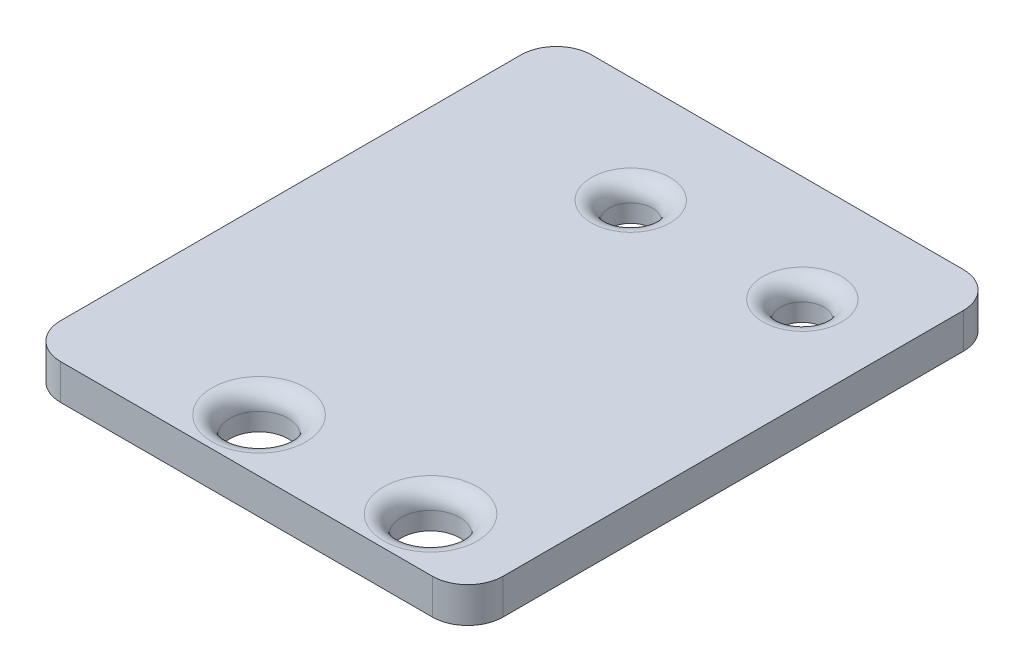
ISO-10303-21;
HEADER;
FILE_DESCRIPTION(('STEP AP214'),'2;1');
FILE_NAME('part.step','',(''),(''),'','','');
FILE_SCHEMA(('AUTOMOTIVE_DESIGN { 1 0 10303 214 1 1 1 1 }'));
ENDSEC;
DATA;
#1=APPLICATION_CONTEXT('core data for automotive mechanical design processes');
#2=APPLICATION_PROTOCOL_DEFINITION('international standard','automotive_design',2000,#1);
#3=PRODUCT_CONTEXT('',#1,'mechanical');
#4=PRODUCT('Part','Part','',(#3));
#5=PRODUCT_RELATED_PRODUCT_CATEGORY('part','',(#4));
#6=PRODUCT_DEFINITION_FORMATION('','',#4);
#7=PRODUCT_DEFINITION_CONTEXT('part definition',#1,'design');
#8=PRODUCT_DEFINITION('design','',#6,#7);
#9=PRODUCT_DEFINITION_SHAPE('','',#8);
#10=(LENGTH_UNIT() NAMED_UNIT(*) SI_UNIT(.MILLI.,.METRE.));
#11=(NAMED_UNIT(*) PLANE_ANGLE_UNIT() SI_UNIT($,.RADIAN.));
#12=(NAMED_UNIT(*) SI_UNIT($,.STERADIAN.) SOLID_ANGLE_UNIT());
#13=UNCERTAINTY_MEASURE_WITH_UNIT(LENGTH_MEASURE(1.E-05),#10,'distance_accuracy_value','');
#14=(GEOMETRIC_REPRESENTATION_CONTEXT(3) GLOBAL_UNCERTAINTY_ASSIGNED_CONTEXT((#13)) GLOBAL_UNIT_ASSIGNED_CONTEXT((#10,
#11,#12)) REPRESENTATION_CONTEXT('',''));
#15=CARTESIAN_POINT('',(0.,0.,0.));
#16=DIRECTION('',(0.,0.,1.));
#17=DIRECTION('',(1.,0.,0.));
#18=AXIS2_PLACEMENT_3D('',#15,#16,#17);
#19=CARTESIAN_POINT('',(0.,2.,0.));
#20=DIRECTION('',(0.,1.,0.));
#21=DIRECTION('',(0.,0.,1.));
#22=AXIS2_PLACEMENT_3D('',#19,#20,#21);
#23=PLANE('',#22);
#24=CARTESIAN_POINT('',(19.9,2.,-3.));
#25=DIRECTION('',(0.,1.,0.));
#26=DIRECTION('',(0.,0.,1.));
#27=AXIS2_PLACEMENT_3D('',#24,#25,#26);
#28=CIRCLE('',#27,2.65);
#29=CARTESIAN_POINT('',(19.9,2.,-0.35));
#30=VERTEX_POINT('',#29);
#31=EDGE_CURVE('E210',#30,#30,#28,.F.);
#32=ORIENTED_EDGE('',*,*,#31,.T.);
#33=EDGE_LOOP('',(#32));
#34=FACE_BOUND('',#33,.T.);
#35=CARTESIAN_POINT('',(10.21,2.,-3.));
#36=DIRECTION('',(0.,1.,0.));
#37=DIRECTION('',(0.,0.,1.));
#38=AXIS2_PLACEMENT_3D('',#35,#36,#37);
#39=CIRCLE('',#38,2.65);
#40=CARTESIAN_POINT('',(10.21,2.,-0.349999999999999));
#41=VERTEX_POINT('',#40);
#42=EDGE_CURVE('E206',#41,#41,#39,.F.);
#43=ORIENTED_EDGE('',*,*,#42,.T.);
#44=EDGE_LOOP('',(#43));
#45=FACE_BOUND('',#44,.T.);
#46=CARTESIAN_POINT('',(19.9,2.,-24.));
#47=DIRECTION('',(0.,1.,0.));
#48=DIRECTION('',(0.,0.,1.));
#49=AXIS2_PLACEMENT_3D('',#46,#47,#48);
#50=CIRCLE('',#49,2.225);
#51=CARTESIAN_POINT('',(19.9,2.,-21.775));
#52=VERTEX_POINT('',#51);
#53=EDGE_CURVE('E202',#52,#52,#50,.F.);
#54=ORIENTED_EDGE('',*,*,#53,.T.);
#55=EDGE_LOOP('',(#54));
#56=FACE_BOUND('',#55,.T.);
#57=CARTESIAN_POINT('',(10.21,2.,-24.));
#58=DIRECTION('',(0.,1.,0.));
#59=DIRECTION('',(0.,0.,1.));
#60=AXIS2_PLACEMENT_3D('',#57,#58,#59);
#61=CIRCLE('',#60,2.225);
#62=CARTESIAN_POINT('',(10.21,2.,-21.775));
#63=VERTEX_POINT('',#62);
#64=EDGE_CURVE('E198',#63,#63,#61,.F.);
#65=ORIENTED_EDGE('',*,*,#64,.T.);
#66=EDGE_LOOP('',(#65));
#67=FACE_BOUND('',#66,.T.);
#68=DIRECTION('',(-1.,0.,0.));
#69=VECTOR('',#68,1.);
#70=CARTESIAN_POINT('',(25.,2.,-30.));
#71=LINE('',#70,#69);
#72=CARTESIAN_POINT('',(23.,2.,-30.));
#73=VERTEX_POINT('',#72);
#74=CARTESIAN_POINT('',(2.,2.,-30.));
#75=VERTEX_POINT('',#74);
#76=EDGE_CURVE('E148',#73,#75,#71,.T.);
#77=ORIENTED_EDGE('',*,*,#76,.T.);
#78=CARTESIAN_POINT('',(2.,2.,-28.));
#79=DIRECTION('',(0.,1.,0.));
#80=DIRECTION('',(0.,0.,1.));
#81=AXIS2_PLACEMENT_3D('',#78,#79,#80);
#82=CIRCLE('',#81,2.);
#83=CARTESIAN_POINT('',(0.,2.,-28.));
#84=VERTEX_POINT('',#83);
#85=EDGE_CURVE('E178',#75,#84,#82,.T.);
#86=ORIENTED_EDGE('',*,*,#85,.T.);
#87=DIRECTION('',(0.,0.,1.));
#88=VECTOR('',#87,1.);
#89=CARTESIAN_POINT('',(0.,2.,-30.));
#90=LINE('',#89,#88);
#91=CARTESIAN_POINT('',(0.,2.,-2.));
#92=VERTEX_POINT('',#91);
#93=EDGE_CURVE('E127',#84,#92,#90,.T.);
#94=ORIENTED_EDGE('',*,*,#93,.T.);
#95=CARTESIAN_POINT('',(2.,2.,-2.));
#96=DIRECTION('',(0.,1.,0.));
#97=DIRECTION('',(0.,0.,1.));
#98=AXIS2_PLACEMENT_3D('',#95,#96,#97);
#99=CIRCLE('',#98,2.);
#100=CARTESIAN_POINT('',(2.,2.,0.));
#101=VERTEX_POINT('',#100);
#102=EDGE_CURVE('E175',#92,#101,#99,.T.);
#103=ORIENTED_EDGE('',*,*,#102,.T.);
#104=DIRECTION('',(1.,0.,0.));
#105=VECTOR('',#104,1.);
#106=CARTESIAN_POINT('',(0.,2.,0.));
#107=LINE('',#106,#105);
#108=CARTESIAN_POINT('',(23.,2.,0.));
#109=VERTEX_POINT('',#108);
#110=EDGE_CURVE('E304',#101,#109,#107,.T.);
#111=ORIENTED_EDGE('',*,*,#110,.T.);
#112=CARTESIAN_POINT('',(23.,2.,-2.));
#113=DIRECTION('',(0.,1.,0.));
#114=DIRECTION('',(0.,0.,1.));
#115=AXIS2_PLACEMENT_3D('',#112,#113,#114);
#116=CIRCLE('',#115,2.);
#117=CARTESIAN_POINT('',(25.,2.,-2.));
#118=VERTEX_POINT('',#117);
#119=EDGE_CURVE('E61',#109,#118,#116,.T.);
#120=ORIENTED_EDGE('',*,*,#119,.T.);
#121=DIRECTION('',(0.,0.,-1.));
#122=VECTOR('',#121,1.);
#123=CARTESIAN_POINT('',(25.,2.,0.));
#124=LINE('',#123,#122);
#125=CARTESIAN_POINT('',(25.,2.,-28.));
#126=VERTEX_POINT('',#125);
#127=EDGE_CURVE('E306',#118,#126,#124,.T.);
#128=ORIENTED_EDGE('',*,*,#127,.T.);
#129=CARTESIAN_POINT('',(23.,2.,-28.));
#130=DIRECTION('',(0.,1.,0.));
#131=DIRECTION('',(0.,0.,1.));
#132=AXIS2_PLACEMENT_3D('',#129,#130,#131);
#133=CIRCLE('',#132,2.);
#134=EDGE_CURVE('E170',#126,#73,#133,.T.);
#135=ORIENTED_EDGE('',*,*,#134,.T.);
#136=EDGE_LOOP('',(#77,#86,#94,#103,#111,#120,#128,#135));
#137=FACE_BOUND('',#136,.T.);
#138=ADVANCED_FACE('F38',(#34,#45,#56,#67,#137),#23,.T.);
#139=CARTESIAN_POINT('',(0.,0.,0.));
#140=DIRECTION('',(0.,1.,0.));
#141=DIRECTION('',(0.,0.,1.));
#142=AXIS2_PLACEMENT_3D('',#139,#140,#141);
#143=PLANE('',#142);
#144=DIRECTION('',(0.,0.,1.));
#145=VECTOR('',#144,1.);
#146=CARTESIAN_POINT('',(0.,0.,-30.));
#147=LINE('',#146,#145);
#148=CARTESIAN_POINT('',(0.,0.,-28.));
#149=VERTEX_POINT('',#148);
#150=CARTESIAN_POINT('',(0.,0.,-2.));
#151=VERTEX_POINT('',#150);
#152=EDGE_CURVE('E124',#149,#151,#147,.T.);
#153=ORIENTED_EDGE('',*,*,#152,.F.);
#154=CARTESIAN_POINT('',(2.,0.,-28.));
#155=DIRECTION('',(0.,1.,0.));
#156=DIRECTION('',(0.,0.,1.));
#157=AXIS2_PLACEMENT_3D('',#154,#155,#156);
#158=CIRCLE('',#157,2.);
#159=CARTESIAN_POINT('',(2.,0.,-30.));
#160=VERTEX_POINT('',#159);
#161=EDGE_CURVE('E106',#149,#160,#158,.F.);
#162=ORIENTED_EDGE('',*,*,#161,.T.);
#163=DIRECTION('',(-1.,0.,0.));
#164=VECTOR('',#163,1.);
#165=CARTESIAN_POINT('',(25.,0.,-30.));
#166=LINE('',#165,#164);
#167=CARTESIAN_POINT('',(23.,0.,-30.));
#168=VERTEX_POINT('',#167);
#169=EDGE_CURVE('E153',#168,#160,#166,.T.);
#170=ORIENTED_EDGE('',*,*,#169,.F.);
#171=CARTESIAN_POINT('',(23.,0.,-28.));
#172=DIRECTION('',(0.,1.,0.));
#173=DIRECTION('',(0.,0.,1.));
#174=AXIS2_PLACEMENT_3D('',#171,#172,#173);
#175=CIRCLE('',#174,2.);
#176=CARTESIAN_POINT('',(25.,0.,-28.));
#177=VERTEX_POINT('',#176);
#178=EDGE_CURVE('E129',#168,#177,#175,.F.);
#179=ORIENTED_EDGE('',*,*,#178,.T.);
#180=DIRECTION('',(0.,0.,-1.));
#181=VECTOR('',#180,1.);
#182=CARTESIAN_POINT('',(25.,0.,0.));
#183=LINE('',#182,#181);
#184=CARTESIAN_POINT('',(25.,0.,-2.));
#185=VERTEX_POINT('',#184);
#186=EDGE_CURVE('E142',#185,#177,#183,.T.);
#187=ORIENTED_EDGE('',*,*,#186,.F.);
#188=CARTESIAN_POINT('',(23.,0.,-2.));
#189=DIRECTION('',(0.,1.,0.));
#190=DIRECTION('',(0.,0.,1.));
#191=AXIS2_PLACEMENT_3D('',#188,#189,#190);
#192=CIRCLE('',#191,2.);
#193=CARTESIAN_POINT('',(23.,0.,0.));
#194=VERTEX_POINT('',#193);
#195=EDGE_CURVE('E160',#185,#194,#192,.F.);
#196=ORIENTED_EDGE('',*,*,#195,.T.);
#197=DIRECTION('',(1.,0.,0.));
#198=VECTOR('',#197,1.);
#199=CARTESIAN_POINT('',(0.,0.,0.));
#200=LINE('',#199,#198);
#201=CARTESIAN_POINT('',(2.,0.,0.));
#202=VERTEX_POINT('',#201);
#203=EDGE_CURVE('E136',#202,#194,#200,.T.);
#204=ORIENTED_EDGE('',*,*,#203,.F.);
#205=CARTESIAN_POINT('',(2.,0.,-2.));
#206=DIRECTION('',(0.,1.,0.));
#207=DIRECTION('',(0.,0.,1.));
#208=AXIS2_PLACEMENT_3D('',#205,#206,#207);
#209=CIRCLE('',#208,2.);
#210=EDGE_CURVE('E118',#202,#151,#209,.F.);
#211=ORIENTED_EDGE('',*,*,#210,.T.);
#212=EDGE_LOOP('',(#153,#162,#170,#179,#187,#196,#204,#211));
#213=FACE_BOUND('',#212,.T.);
#214=CARTESIAN_POINT('',(19.9,0.,-24.));
#215=DIRECTION('',(0.,1.,0.));
#216=DIRECTION('',(0.,0.,1.));
#217=AXIS2_PLACEMENT_3D('',#214,#215,#216);
#218=CIRCLE('',#217,1.225);
#219=CARTESIAN_POINT('',(19.9,0.,-22.775));
#220=VERTEX_POINT('',#219);
#221=EDGE_CURVE('E137',#220,#220,#218,.T.);
#222=ORIENTED_EDGE('',*,*,#221,.T.);
#223=EDGE_LOOP('',(#222));
#224=FACE_BOUND('',#223,.T.);
#225=CARTESIAN_POINT('',(10.21,0.,-24.));
#226=DIRECTION('',(0.,1.,0.));
#227=DIRECTION('',(0.,0.,1.));
#228=AXIS2_PLACEMENT_3D('',#225,#226,#227);
#229=CIRCLE('',#228,1.225);
#230=CARTESIAN_POINT('',(10.21,0.,-22.775));
#231=VERTEX_POINT('',#230);
#232=EDGE_CURVE('E145',#231,#231,#229,.T.);
#233=ORIENTED_EDGE('',*,*,#232,.T.);
#234=EDGE_LOOP('',(#233));
#235=FACE_BOUND('',#234,.T.);
#236=CARTESIAN_POINT('',(10.21,0.,-3.));
#237=DIRECTION('',(0.,1.,0.));
#238=DIRECTION('',(0.,0.,1.));
#239=AXIS2_PLACEMENT_3D('',#236,#237,#238);
#240=CIRCLE('',#239,1.65);
#241=CARTESIAN_POINT('',(10.21,0.,-1.35));
#242=VERTEX_POINT('',#241);
#243=EDGE_CURVE('E293',#242,#242,#240,.T.);
#244=ORIENTED_EDGE('',*,*,#243,.T.);
#245=EDGE_LOOP('',(#244));
#246=FACE_BOUND('',#245,.T.);
#247=CARTESIAN_POINT('',(19.9,0.,-3.));
#248=DIRECTION('',(0.,1.,0.));
#249=DIRECTION('',(0.,0.,1.));
#250=AXIS2_PLACEMENT_3D('',#247,#248,#249);
#251=CIRCLE('',#250,1.65);
#252=CARTESIAN_POINT('',(19.9,0.,-1.35));
#253=VERTEX_POINT('',#252);
#254=EDGE_CURVE('E290',#253,#253,#251,.T.);
#255=ORIENTED_EDGE('',*,*,#254,.T.);
#256=EDGE_LOOP('',(#255));
#257=FACE_BOUND('',#256,.T.);
#258=ADVANCED_FACE('F132',(#213,#224,#235,#246,#257),#143,.F.);
#259=CARTESIAN_POINT('',(0.,2.,-30.));
#260=DIRECTION('',(1.,0.,0.));
#261=DIRECTION('',(0.,0.,-1.));
#262=AXIS2_PLACEMENT_3D('',#259,#260,#261);
#263=PLANE('',#262);
#264=ORIENTED_EDGE('',*,*,#93,.F.);
#265=DIRECTION('',(0.,-1.,0.));
#266=VECTOR('',#265,1.);
#267=CARTESIAN_POINT('',(0.,2.,-28.));
#268=LINE('',#267,#266);
#269=EDGE_CURVE('E110',#84,#149,#268,.T.);
#270=ORIENTED_EDGE('',*,*,#269,.T.);
#271=ORIENTED_EDGE('',*,*,#152,.T.);
#272=DIRECTION('',(0.,-1.,0.));
#273=VECTOR('',#272,1.);
#274=CARTESIAN_POINT('',(0.,2.,-2.));
#275=LINE('',#274,#273);
#276=EDGE_CURVE('E130',#151,#92,#275,.F.);
#277=ORIENTED_EDGE('',*,*,#276,.T.);
#278=EDGE_LOOP('',(#264,#270,#271,#277));
#279=FACE_BOUND('',#278,.T.);
#280=ADVANCED_FACE('F123',(#279),#263,.F.);
#281=CARTESIAN_POINT('',(0.,2.,0.));
#282=DIRECTION('',(0.,0.,-1.));
#283=DIRECTION('',(-1.,0.,0.));
#284=AXIS2_PLACEMENT_3D('',#281,#282,#283);
#285=PLANE('',#284);
#286=ORIENTED_EDGE('',*,*,#110,.F.);
#287=DIRECTION('',(0.,-1.,0.));
#288=VECTOR('',#287,1.);
#289=CARTESIAN_POINT('',(2.,2.,0.));
#290=LINE('',#289,#288);
#291=EDGE_CURVE('E184',#101,#202,#290,.T.);
#292=ORIENTED_EDGE('',*,*,#291,.T.);
#293=ORIENTED_EDGE('',*,*,#203,.T.);
#294=DIRECTION('',(0.,-1.,0.));
#295=VECTOR('',#294,1.);
#296=CARTESIAN_POINT('',(23.,2.,0.));
#297=LINE('',#296,#295);
#298=EDGE_CURVE('E181',#194,#109,#297,.F.);
#299=ORIENTED_EDGE('',*,*,#298,.T.);
#300=EDGE_LOOP('',(#286,#292,#293,#299));
#301=FACE_BOUND('',#300,.T.);
#302=ADVANCED_FACE('F255',(#301),#285,.F.);
#303=CARTESIAN_POINT('',(25.,2.,0.));
#304=DIRECTION('',(-1.,0.,0.));
#305=DIRECTION('',(0.,0.,1.));
#306=AXIS2_PLACEMENT_3D('',#303,#304,#305);
#307=PLANE('',#306);
#308=ORIENTED_EDGE('',*,*,#127,.F.);
#309=DIRECTION('',(0.,-1.,0.));
#310=VECTOR('',#309,1.);
#311=CARTESIAN_POINT('',(25.,2.,-2.));
#312=LINE('',#311,#310);
#313=EDGE_CURVE('E190',#118,#185,#312,.T.);
#314=ORIENTED_EDGE('',*,*,#313,.T.);
#315=ORIENTED_EDGE('',*,*,#186,.T.);
#316=DIRECTION('',(0.,-1.,0.));
#317=VECTOR('',#316,1.);
#318=CARTESIAN_POINT('',(25.,2.,-28.));
#319=LINE('',#318,#317);
#320=EDGE_CURVE('E54',#177,#126,#319,.F.);
#321=ORIENTED_EDGE('',*,*,#320,.T.);
#322=EDGE_LOOP('',(#308,#314,#315,#321));
#323=FACE_BOUND('',#322,.T.);
#324=ADVANCED_FACE('F251',(#323),#307,.F.);
#325=CARTESIAN_POINT('',(25.,2.,-30.));
#326=DIRECTION('',(0.,0.,1.));
#327=DIRECTION('',(1.,0.,0.));
#328=AXIS2_PLACEMENT_3D('',#325,#326,#327);
#329=PLANE('',#328);
#330=ORIENTED_EDGE('',*,*,#169,.T.);
#331=DIRECTION('',(0.,-1.,0.));
#332=VECTOR('',#331,1.);
#333=CARTESIAN_POINT('',(2.,2.,-30.));
#334=LINE('',#333,#332);
#335=EDGE_CURVE('E111',#160,#75,#334,.F.);
#336=ORIENTED_EDGE('',*,*,#335,.T.);
#337=ORIENTED_EDGE('',*,*,#76,.F.);
#338=DIRECTION('',(0.,-1.,0.));
#339=VECTOR('',#338,1.);
#340=CARTESIAN_POINT('',(23.,2.,-30.));
#341=LINE('',#340,#339);
#342=EDGE_CURVE('E117',#73,#168,#341,.T.);
#343=ORIENTED_EDGE('',*,*,#342,.T.);
#344=EDGE_LOOP('',(#330,#336,#337,#343));
#345=FACE_BOUND('',#344,.T.);
#346=ADVANCED_FACE('F248',(#345),#329,.F.);
#347=CARTESIAN_POINT('',(19.9,2.,-24.));
#348=DIRECTION('',(0.,-1.,0.));
#349=DIRECTION('',(0.,0.,-1.));
#350=AXIS2_PLACEMENT_3D('',#347,#348,#349);
#351=CYLINDRICAL_SURFACE('',#350,1.225);
#352=CARTESIAN_POINT('',(19.9,1.,-24.));
#353=DIRECTION('',(0.,1.,0.));
#354=DIRECTION('',(0.,0.,1.));
#355=AXIS2_PLACEMENT_3D('',#352,#353,#354);
#356=CIRCLE('',#355,1.225);
#357=CARTESIAN_POINT('',(19.9,1.,-22.775));
#358=VERTEX_POINT('',#357);
#359=EDGE_CURVE('E47',#358,#358,#356,.T.);
#360=ORIENTED_EDGE('',*,*,#359,.T.);
#361=EDGE_LOOP('',(#360));
#362=FACE_BOUND('',#361,.T.);
#363=ORIENTED_EDGE('',*,*,#221,.F.);
#364=EDGE_LOOP('',(#363));
#365=FACE_BOUND('',#364,.T.);
#366=ADVANCED_FACE('F221',(#362,#365),#351,.F.);
#367=CARTESIAN_POINT('',(10.21,2.,-24.));
#368=DIRECTION('',(0.,-1.,0.));
#369=DIRECTION('',(0.,0.,-1.));
#370=AXIS2_PLACEMENT_3D('',#367,#368,#369);
#371=CYLINDRICAL_SURFACE('',#370,1.225);
#372=CARTESIAN_POINT('',(10.21,1.,-24.));
#373=DIRECTION('',(0.,1.,0.));
#374=DIRECTION('',(0.,0.,1.));
#375=AXIS2_PLACEMENT_3D('',#372,#373,#374);
#376=CIRCLE('',#375,1.225);
#377=CARTESIAN_POINT('',(10.21,1.,-22.775));
#378=VERTEX_POINT('',#377);
#379=EDGE_CURVE('E11',#378,#378,#376,.T.);
#380=ORIENTED_EDGE('',*,*,#379,.T.);
#381=EDGE_LOOP('',(#380));
#382=FACE_BOUND('',#381,.T.);
#383=ORIENTED_EDGE('',*,*,#232,.F.);
#384=EDGE_LOOP('',(#383));
#385=FACE_BOUND('',#384,.T.);
#386=ADVANCED_FACE('F323',(#382,#385),#371,.F.);
#387=CARTESIAN_POINT('',(10.21,2.,-3.));
#388=DIRECTION('',(0.,-1.,0.));
#389=DIRECTION('',(0.,0.,-1.));
#390=AXIS2_PLACEMENT_3D('',#387,#388,#389);
#391=CYLINDRICAL_SURFACE('',#390,1.65);
#392=CARTESIAN_POINT('',(10.21,1.,-3.));
#393=DIRECTION('',(0.,1.,0.));
#394=DIRECTION('',(0.,0.,1.));
#395=AXIS2_PLACEMENT_3D('',#392,#393,#394);
#396=CIRCLE('',#395,1.65);
#397=CARTESIAN_POINT('',(10.21,1.,-1.35));
#398=VERTEX_POINT('',#397);
#399=EDGE_CURVE('E214',#398,#398,#396,.T.);
#400=ORIENTED_EDGE('',*,*,#399,.T.);
#401=EDGE_LOOP('',(#400));
#402=FACE_BOUND('',#401,.T.);
#403=ORIENTED_EDGE('',*,*,#243,.F.);
#404=EDGE_LOOP('',(#403));
#405=FACE_BOUND('',#404,.T.);
#406=ADVANCED_FACE('F286',(#402,#405),#391,.F.);
#407=CARTESIAN_POINT('',(19.9,2.,-3.));
#408=DIRECTION('',(0.,-1.,0.));
#409=DIRECTION('',(0.,0.,-1.));
#410=AXIS2_PLACEMENT_3D('',#407,#408,#409);
#411=CYLINDRICAL_SURFACE('',#410,1.65);
#412=CARTESIAN_POINT('',(19.9,1.,-3.));
#413=DIRECTION('',(0.,1.,0.));
#414=DIRECTION('',(0.,0.,1.));
#415=AXIS2_PLACEMENT_3D('',#412,#413,#414);
#416=CIRCLE('',#415,1.65);
#417=CARTESIAN_POINT('',(19.9,1.,-1.35));
#418=VERTEX_POINT('',#417);
#419=EDGE_CURVE('E194',#418,#418,#416,.T.);
#420=ORIENTED_EDGE('',*,*,#419,.T.);
#421=EDGE_LOOP('',(#420));
#422=FACE_BOUND('',#421,.T.);
#423=ORIENTED_EDGE('',*,*,#254,.F.);
#424=EDGE_LOOP('',(#423));
#425=FACE_BOUND('',#424,.T.);
#426=ADVANCED_FACE('F264',(#422,#425),#411,.F.);
#427=CARTESIAN_POINT('',(2.,2.,-28.));
#428=DIRECTION('',(0.,-1.,0.));
#429=DIRECTION('',(0.,0.,-1.));
#430=AXIS2_PLACEMENT_3D('',#427,#428,#429);
#431=CYLINDRICAL_SURFACE('',#430,2.);
#432=ORIENTED_EDGE('',*,*,#85,.F.);
#433=ORIENTED_EDGE('',*,*,#335,.F.);
#434=ORIENTED_EDGE('',*,*,#161,.F.);
#435=ORIENTED_EDGE('',*,*,#269,.F.);
#436=EDGE_LOOP('',(#432,#433,#434,#435));
#437=FACE_BOUND('',#436,.T.);
#438=ADVANCED_FACE('F109',(#437),#431,.T.);
#439=CARTESIAN_POINT('',(2.,2.,-2.));
#440=DIRECTION('',(0.,-1.,0.));
#441=DIRECTION('',(0.,0.,-1.));
#442=AXIS2_PLACEMENT_3D('',#439,#440,#441);
#443=CYLINDRICAL_SURFACE('',#442,2.);
#444=ORIENTED_EDGE('',*,*,#102,.F.);
#445=ORIENTED_EDGE('',*,*,#276,.F.);
#446=ORIENTED_EDGE('',*,*,#210,.F.);
#447=ORIENTED_EDGE('',*,*,#291,.F.);
#448=EDGE_LOOP('',(#444,#445,#446,#447));
#449=FACE_BOUND('',#448,.T.);
#450=ADVANCED_FACE('F263',(#449),#443,.T.);
#451=CARTESIAN_POINT('',(23.,2.,-2.));
#452=DIRECTION('',(0.,-1.,0.));
#453=DIRECTION('',(0.,0.,-1.));
#454=AXIS2_PLACEMENT_3D('',#451,#452,#453);
#455=CYLINDRICAL_SURFACE('',#454,2.);
#456=ORIENTED_EDGE('',*,*,#119,.F.);
#457=ORIENTED_EDGE('',*,*,#298,.F.);
#458=ORIENTED_EDGE('',*,*,#195,.F.);
#459=ORIENTED_EDGE('',*,*,#313,.F.);
#460=EDGE_LOOP('',(#456,#457,#458,#459));
#461=FACE_BOUND('',#460,.T.);
#462=ADVANCED_FACE('F267',(#461),#455,.T.);
#463=CARTESIAN_POINT('',(23.,2.,-28.));
#464=DIRECTION('',(0.,-1.,0.));
#465=DIRECTION('',(0.,0.,-1.));
#466=AXIS2_PLACEMENT_3D('',#463,#464,#465);
#467=CYLINDRICAL_SURFACE('',#466,2.);
#468=ORIENTED_EDGE('',*,*,#134,.F.);
#469=ORIENTED_EDGE('',*,*,#320,.F.);
#470=ORIENTED_EDGE('',*,*,#178,.F.);
#471=ORIENTED_EDGE('',*,*,#342,.F.);
#472=EDGE_LOOP('',(#468,#469,#470,#471));
#473=FACE_BOUND('',#472,.T.);
#474=ADVANCED_FACE('F271',(#473),#467,.T.);
#475=CARTESIAN_POINT('',(19.9,1.,-3.));
#476=DIRECTION('',(0.,1.,0.));
#477=DIRECTION('',(0.,0.,1.));
#478=AXIS2_PLACEMENT_3D('',#475,#476,#477);
#479=TOROIDAL_SURFACE('',#478,2.65,1.);
#480=ORIENTED_EDGE('',*,*,#31,.F.);
#481=EDGE_LOOP('',(#480));
#482=FACE_BOUND('',#481,.T.);
#483=ORIENTED_EDGE('',*,*,#419,.F.);
#484=EDGE_LOOP('',(#483));
#485=FACE_BOUND('',#484,.T.);
#486=ADVANCED_FACE('F233',(#482,#485),#479,.T.);
#487=CARTESIAN_POINT('',(10.21,1.,-3.));
#488=DIRECTION('',(0.,1.,0.));
#489=DIRECTION('',(0.,0.,1.));
#490=AXIS2_PLACEMENT_3D('',#487,#488,#489);
#491=TOROIDAL_SURFACE('',#490,2.65,1.);
#492=ORIENTED_EDGE('',*,*,#42,.F.);
#493=EDGE_LOOP('',(#492));
#494=FACE_BOUND('',#493,.T.);
#495=ORIENTED_EDGE('',*,*,#399,.F.);
#496=EDGE_LOOP('',(#495));
#497=FACE_BOUND('',#496,.T.);
#498=ADVANCED_FACE('F226',(#494,#497),#491,.T.);
#499=CARTESIAN_POINT('',(19.9,1.,-24.));
#500=DIRECTION('',(0.,1.,0.));
#501=DIRECTION('',(0.,0.,1.));
#502=AXIS2_PLACEMENT_3D('',#499,#500,#501);
#503=TOROIDAL_SURFACE('',#502,2.225,1.);
#504=ORIENTED_EDGE('',*,*,#53,.F.);
#505=EDGE_LOOP('',(#504));
#506=FACE_BOUND('',#505,.T.);
#507=ORIENTED_EDGE('',*,*,#359,.F.);
#508=EDGE_LOOP('',(#507));
#509=FACE_BOUND('',#508,.T.);
#510=ADVANCED_FACE('F224',(#506,#509),#503,.T.);
#511=CARTESIAN_POINT('',(10.21,1.,-24.));
#512=DIRECTION('',(0.,1.,0.));
#513=DIRECTION('',(0.,0.,1.));
#514=AXIS2_PLACEMENT_3D('',#511,#512,#513);
#515=TOROIDAL_SURFACE('',#514,2.225,1.);
#516=ORIENTED_EDGE('',*,*,#64,.F.);
#517=EDGE_LOOP('',(#516));
#518=FACE_BOUND('',#517,.T.);
#519=ORIENTED_EDGE('',*,*,#379,.F.);
#520=EDGE_LOOP('',(#519));
#521=FACE_BOUND('',#520,.T.);
#522=ADVANCED_FACE('F40',(#518,#521),#515,.T.);
#523=CLOSED_SHELL('',(#138,#258,#280,#302,#324,#346,#366,#386,#406,#426,#438,#450,#462,#474,
#486,#498,#510,#522));
#524=MANIFOLD_SOLID_BREP('B2',#523);
#525=ADVANCED_BREP_SHAPE_REPRESENTATION('',(#18,#524),#14);
#526=SHAPE_DEFINITION_REPRESENTATION(#9,#525);
ENDSEC;
END-ISO-10303-21;
